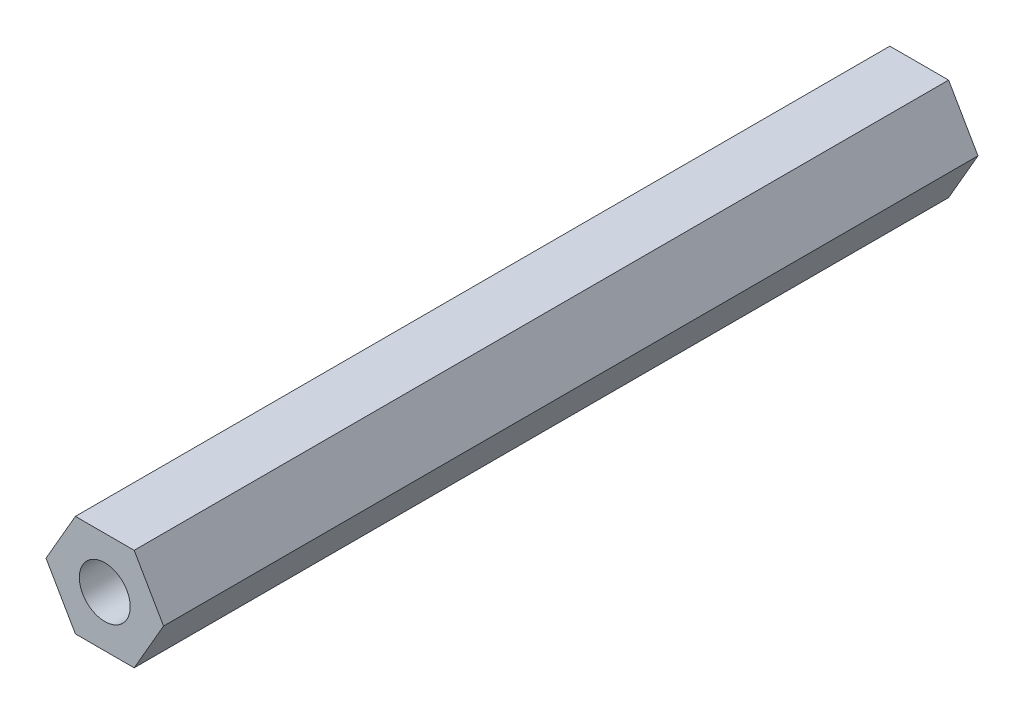
ISO-10303-21;
HEADER;
FILE_DESCRIPTION(('STEP AP214'),'2;1');
FILE_NAME('part.step','',(''),(''),'','','');
FILE_SCHEMA(('AUTOMOTIVE_DESIGN { 1 0 10303 214 1 1 1 1 }'));
ENDSEC;
DATA;
#1=APPLICATION_CONTEXT('core data for automotive mechanical design processes');
#2=APPLICATION_PROTOCOL_DEFINITION('international standard','automotive_design',2000,#1);
#3=PRODUCT_CONTEXT('',#1,'mechanical');
#4=PRODUCT('Part','Part','',(#3));
#5=PRODUCT_RELATED_PRODUCT_CATEGORY('part','',(#4));
#6=PRODUCT_DEFINITION_FORMATION('','',#4);
#7=PRODUCT_DEFINITION_CONTEXT('part definition',#1,'design');
#8=PRODUCT_DEFINITION('design','',#6,#7);
#9=PRODUCT_DEFINITION_SHAPE('','',#8);
#10=(LENGTH_UNIT() NAMED_UNIT(*) SI_UNIT(.MILLI.,.METRE.));
#11=(NAMED_UNIT(*) PLANE_ANGLE_UNIT() SI_UNIT($,.RADIAN.));
#12=(NAMED_UNIT(*) SI_UNIT($,.STERADIAN.) SOLID_ANGLE_UNIT());
#13=UNCERTAINTY_MEASURE_WITH_UNIT(LENGTH_MEASURE(1.E-05),#10,'distance_accuracy_value','');
#14=(GEOMETRIC_REPRESENTATION_CONTEXT(3) GLOBAL_UNCERTAINTY_ASSIGNED_CONTEXT((#13)) GLOBAL_UNIT_ASSIGNED_CONTEXT((#10,
#11,#12)) REPRESENTATION_CONTEXT('',''));
#15=CARTESIAN_POINT('',(0.,0.,0.));
#16=DIRECTION('',(0.,0.,1.));
#17=DIRECTION('',(1.,0.,0.));
#18=AXIS2_PLACEMENT_3D('',#15,#16,#17);
#19=CARTESIAN_POINT('',(0.,0.,101.6));
#20=DIRECTION('',(0.,0.,1.));
#21=DIRECTION('',(1.,0.,0.));
#22=AXIS2_PLACEMENT_3D('',#19,#20,#21);
#23=PLANE('',#22);
#24=DIRECTION('',(-0.5,0.866025403784439,0.));
#25=VECTOR('',#24,1.);
#26=CARTESIAN_POINT('',(7.33234841870825,0.,101.6));
#27=LINE('',#26,#25);
#28=CARTESIAN_POINT('',(7.33234841870825,0.,101.6));
#29=VERTEX_POINT('',#28);
#30=CARTESIAN_POINT('',(3.66617420935413,6.35,101.6));
#31=VERTEX_POINT('',#30);
#32=EDGE_CURVE('E146',#29,#31,#27,.T.);
#33=ORIENTED_EDGE('',*,*,#32,.T.);
#34=DIRECTION('',(-1.,0.,0.));
#35=VECTOR('',#34,1.);
#36=CARTESIAN_POINT('',(3.66617420935413,6.35,101.6));
#37=LINE('',#36,#35);
#38=CARTESIAN_POINT('',(-3.66617420935412,6.35,101.6));
#39=VERTEX_POINT('',#38);
#40=EDGE_CURVE('E94',#31,#39,#37,.T.);
#41=ORIENTED_EDGE('',*,*,#40,.T.);
#42=DIRECTION('',(-0.5,-0.866025403784438,0.));
#43=VECTOR('',#42,1.);
#44=CARTESIAN_POINT('',(-3.66617420935412,6.35,101.6));
#45=LINE('',#44,#43);
#46=CARTESIAN_POINT('',(-7.33234841870825,0.,101.6));
#47=VERTEX_POINT('',#46);
#48=EDGE_CURVE('E107',#39,#47,#45,.T.);
#49=ORIENTED_EDGE('',*,*,#48,.T.);
#50=DIRECTION('',(0.5,-0.866025403784439,0.));
#51=VECTOR('',#50,1.);
#52=CARTESIAN_POINT('',(-7.33234841870825,0.,101.6));
#53=LINE('',#52,#51);
#54=CARTESIAN_POINT('',(-3.66617420935413,-6.35,101.6));
#55=VERTEX_POINT('',#54);
#56=EDGE_CURVE('E101',#47,#55,#53,.T.);
#57=ORIENTED_EDGE('',*,*,#56,.T.);
#58=DIRECTION('',(1.,0.,0.));
#59=VECTOR('',#58,1.);
#60=CARTESIAN_POINT('',(-3.66617420935413,-6.35,101.6));
#61=LINE('',#60,#59);
#62=CARTESIAN_POINT('',(3.66617420935412,-6.35,101.6));
#63=VERTEX_POINT('',#62);
#64=EDGE_CURVE('E105',#55,#63,#61,.T.);
#65=ORIENTED_EDGE('',*,*,#64,.T.);
#66=DIRECTION('',(0.5,0.866025403784438,0.));
#67=VECTOR('',#66,1.);
#68=CARTESIAN_POINT('',(3.66617420935412,-6.35,101.6));
#69=LINE('',#68,#67);
#70=EDGE_CURVE('E57',#63,#29,#69,.T.);
#71=ORIENTED_EDGE('',*,*,#70,.T.);
#72=EDGE_LOOP('',(#33,#41,#49,#57,#65,#71));
#73=FACE_BOUND('',#72,.T.);
#74=CARTESIAN_POINT('',(0.,0.,101.6));
#75=DIRECTION('',(0.,0.,1.));
#76=DIRECTION('',(1.,0.,0.));
#77=AXIS2_PLACEMENT_3D('',#74,#75,#76);
#78=CIRCLE('',#77,3.175);
#79=CARTESIAN_POINT('',(3.175,0.,101.6));
#80=VERTEX_POINT('',#79);
#81=EDGE_CURVE('E134',#80,#80,#78,.T.);
#82=ORIENTED_EDGE('',*,*,#81,.F.);
#83=EDGE_LOOP('',(#82));
#84=FACE_BOUND('',#83,.T.);
#85=ADVANCED_FACE('F39',(#73,#84),#23,.T.);
#86=CARTESIAN_POINT('',(0.,0.,0.));
#87=DIRECTION('',(0.,0.,1.));
#88=DIRECTION('',(1.,0.,0.));
#89=AXIS2_PLACEMENT_3D('',#86,#87,#88);
#90=PLANE('',#89);
#91=DIRECTION('',(-0.5,0.866025403784439,0.));
#92=VECTOR('',#91,1.);
#93=CARTESIAN_POINT('',(7.33234841870825,0.,0.));
#94=LINE('',#93,#92);
#95=CARTESIAN_POINT('',(7.33234841870825,0.,0.));
#96=VERTEX_POINT('',#95);
#97=CARTESIAN_POINT('',(3.66617420935413,6.35,0.));
#98=VERTEX_POINT('',#97);
#99=EDGE_CURVE('E129',#96,#98,#94,.T.);
#100=ORIENTED_EDGE('',*,*,#99,.F.);
#101=DIRECTION('',(0.5,0.866025403784438,0.));
#102=VECTOR('',#101,1.);
#103=CARTESIAN_POINT('',(3.66617420935412,-6.35,0.));
#104=LINE('',#103,#102);
#105=CARTESIAN_POINT('',(3.66617420935412,-6.35,0.));
#106=VERTEX_POINT('',#105);
#107=EDGE_CURVE('E86',#106,#96,#104,.T.);
#108=ORIENTED_EDGE('',*,*,#107,.F.);
#109=DIRECTION('',(1.,0.,0.));
#110=VECTOR('',#109,1.);
#111=CARTESIAN_POINT('',(-3.66617420935413,-6.35,0.));
#112=LINE('',#111,#110);
#113=CARTESIAN_POINT('',(-3.66617420935413,-6.35,0.));
#114=VERTEX_POINT('',#113);
#115=EDGE_CURVE('E80',#114,#106,#112,.T.);
#116=ORIENTED_EDGE('',*,*,#115,.F.);
#117=DIRECTION('',(0.5,-0.866025403784439,0.));
#118=VECTOR('',#117,1.);
#119=CARTESIAN_POINT('',(-7.33234841870825,0.,0.));
#120=LINE('',#119,#118);
#121=CARTESIAN_POINT('',(-7.33234841870825,0.,0.));
#122=VERTEX_POINT('',#121);
#123=EDGE_CURVE('E116',#122,#114,#120,.T.);
#124=ORIENTED_EDGE('',*,*,#123,.F.);
#125=DIRECTION('',(-0.5,-0.866025403784438,0.));
#126=VECTOR('',#125,1.);
#127=CARTESIAN_POINT('',(-3.66617420935412,6.35,0.));
#128=LINE('',#127,#126);
#129=CARTESIAN_POINT('',(-3.66617420935412,6.35,0.));
#130=VERTEX_POINT('',#129);
#131=EDGE_CURVE('E137',#130,#122,#128,.T.);
#132=ORIENTED_EDGE('',*,*,#131,.F.);
#133=DIRECTION('',(-1.,0.,0.));
#134=VECTOR('',#133,1.);
#135=CARTESIAN_POINT('',(3.66617420935413,6.35,0.));
#136=LINE('',#135,#134);
#137=EDGE_CURVE('E133',#98,#130,#136,.T.);
#138=ORIENTED_EDGE('',*,*,#137,.F.);
#139=EDGE_LOOP('',(#100,#108,#116,#124,#132,#138));
#140=FACE_BOUND('',#139,.T.);
#141=CARTESIAN_POINT('',(0.,0.,0.));
#142=DIRECTION('',(0.,0.,1.));
#143=DIRECTION('',(1.,0.,0.));
#144=AXIS2_PLACEMENT_3D('',#141,#142,#143);
#145=CIRCLE('',#144,3.175);
#146=CARTESIAN_POINT('',(3.175,0.,0.));
#147=VERTEX_POINT('',#146);
#148=EDGE_CURVE('E243',#147,#147,#145,.T.);
#149=ORIENTED_EDGE('',*,*,#148,.T.);
#150=EDGE_LOOP('',(#149));
#151=FACE_BOUND('',#150,.T.);
#152=ADVANCED_FACE('F159',(#140,#151),#90,.F.);
#153=CARTESIAN_POINT('',(7.33234841870825,0.,101.6));
#154=DIRECTION('',(-0.866025403784439,-0.5,0.));
#155=DIRECTION('',(0.5,-0.866025403784439,0.));
#156=AXIS2_PLACEMENT_3D('',#153,#154,#155);
#157=PLANE('',#156);
#158=ORIENTED_EDGE('',*,*,#99,.T.);
#159=DIRECTION('',(0.,0.,-1.));
#160=VECTOR('',#159,1.);
#161=CARTESIAN_POINT('',(3.66617420935413,6.35,101.6));
#162=LINE('',#161,#160);
#163=EDGE_CURVE('E11',#31,#98,#162,.T.);
#164=ORIENTED_EDGE('',*,*,#163,.F.);
#165=ORIENTED_EDGE('',*,*,#32,.F.);
#166=DIRECTION('',(0.,0.,-1.));
#167=VECTOR('',#166,1.);
#168=CARTESIAN_POINT('',(7.33234841870825,0.,101.6));
#169=LINE('',#168,#167);
#170=EDGE_CURVE('E125',#29,#96,#169,.T.);
#171=ORIENTED_EDGE('',*,*,#170,.T.);
#172=EDGE_LOOP('',(#158,#164,#165,#171));
#173=FACE_BOUND('',#172,.T.);
#174=ADVANCED_FACE('F41',(#173),#157,.F.);
#175=CARTESIAN_POINT('',(3.66617420935413,6.35,101.6));
#176=DIRECTION('',(0.,-1.,0.));
#177=DIRECTION('',(1.,0.,0.));
#178=AXIS2_PLACEMENT_3D('',#175,#176,#177);
#179=PLANE('',#178);
#180=ORIENTED_EDGE('',*,*,#137,.T.);
#181=DIRECTION('',(0.,0.,-1.));
#182=VECTOR('',#181,1.);
#183=CARTESIAN_POINT('',(-3.66617420935412,6.35,101.6));
#184=LINE('',#183,#182);
#185=EDGE_CURVE('E49',#39,#130,#184,.T.);
#186=ORIENTED_EDGE('',*,*,#185,.F.);
#187=ORIENTED_EDGE('',*,*,#40,.F.);
#188=ORIENTED_EDGE('',*,*,#163,.T.);
#189=EDGE_LOOP('',(#180,#186,#187,#188));
#190=FACE_BOUND('',#189,.T.);
#191=ADVANCED_FACE('F184',(#190),#179,.F.);
#192=CARTESIAN_POINT('',(-3.66617420935412,6.35,101.6));
#193=DIRECTION('',(0.866025403784438,-0.5,0.));
#194=DIRECTION('',(0.5,0.866025403784439,0.));
#195=AXIS2_PLACEMENT_3D('',#192,#193,#194);
#196=PLANE('',#195);
#197=ORIENTED_EDGE('',*,*,#131,.T.);
#198=DIRECTION('',(0.,0.,-1.));
#199=VECTOR('',#198,1.);
#200=CARTESIAN_POINT('',(-7.33234841870825,0.,101.6));
#201=LINE('',#200,#199);
#202=EDGE_CURVE('E118',#47,#122,#201,.T.);
#203=ORIENTED_EDGE('',*,*,#202,.F.);
#204=ORIENTED_EDGE('',*,*,#48,.F.);
#205=ORIENTED_EDGE('',*,*,#185,.T.);
#206=EDGE_LOOP('',(#197,#203,#204,#205));
#207=FACE_BOUND('',#206,.T.);
#208=ADVANCED_FACE('F156',(#207),#196,.F.);
#209=CARTESIAN_POINT('',(-7.33234841870825,0.,101.6));
#210=DIRECTION('',(0.866025403784439,0.5,0.));
#211=DIRECTION('',(-0.5,0.866025403784439,0.));
#212=AXIS2_PLACEMENT_3D('',#209,#210,#211);
#213=PLANE('',#212);
#214=ORIENTED_EDGE('',*,*,#123,.T.);
#215=DIRECTION('',(0.,0.,-1.));
#216=VECTOR('',#215,1.);
#217=CARTESIAN_POINT('',(-3.66617420935413,-6.35,101.6));
#218=LINE('',#217,#216);
#219=EDGE_CURVE('E113',#55,#114,#218,.T.);
#220=ORIENTED_EDGE('',*,*,#219,.F.);
#221=ORIENTED_EDGE('',*,*,#56,.F.);
#222=ORIENTED_EDGE('',*,*,#202,.T.);
#223=EDGE_LOOP('',(#214,#220,#221,#222));
#224=FACE_BOUND('',#223,.T.);
#225=ADVANCED_FACE('F114',(#224),#213,.F.);
#226=CARTESIAN_POINT('',(-3.66617420935413,-6.35,101.6));
#227=DIRECTION('',(0.,1.,0.));
#228=DIRECTION('',(-1.,0.,0.));
#229=AXIS2_PLACEMENT_3D('',#226,#227,#228);
#230=PLANE('',#229);
#231=ORIENTED_EDGE('',*,*,#115,.T.);
#232=DIRECTION('',(0.,0.,-1.));
#233=VECTOR('',#232,1.);
#234=CARTESIAN_POINT('',(3.66617420935412,-6.35,101.6));
#235=LINE('',#234,#233);
#236=EDGE_CURVE('E119',#63,#106,#235,.T.);
#237=ORIENTED_EDGE('',*,*,#236,.F.);
#238=ORIENTED_EDGE('',*,*,#64,.F.);
#239=ORIENTED_EDGE('',*,*,#219,.T.);
#240=EDGE_LOOP('',(#231,#237,#238,#239));
#241=FACE_BOUND('',#240,.T.);
#242=ADVANCED_FACE('F121',(#241),#230,.F.);
#243=CARTESIAN_POINT('',(3.66617420935412,-6.35,101.6));
#244=DIRECTION('',(-0.866025403784438,0.5,0.));
#245=DIRECTION('',(-0.5,-0.866025403784438,0.));
#246=AXIS2_PLACEMENT_3D('',#243,#244,#245);
#247=PLANE('',#246);
#248=ORIENTED_EDGE('',*,*,#107,.T.);
#249=ORIENTED_EDGE('',*,*,#170,.F.);
#250=ORIENTED_EDGE('',*,*,#70,.F.);
#251=ORIENTED_EDGE('',*,*,#236,.T.);
#252=EDGE_LOOP('',(#248,#249,#250,#251));
#253=FACE_BOUND('',#252,.T.);
#254=ADVANCED_FACE('F164',(#253),#247,.F.);
#255=CARTESIAN_POINT('',(0.,0.,101.6));
#256=DIRECTION('',(0.,0.,-1.));
#257=DIRECTION('',(-1.,0.,0.));
#258=AXIS2_PLACEMENT_3D('',#255,#256,#257);
#259=CYLINDRICAL_SURFACE('',#258,3.175);
#260=ORIENTED_EDGE('',*,*,#81,.T.);
#261=EDGE_LOOP('',(#260));
#262=FACE_BOUND('',#261,.T.);
#263=ORIENTED_EDGE('',*,*,#148,.F.);
#264=EDGE_LOOP('',(#263));
#265=FACE_BOUND('',#264,.T.);
#266=ADVANCED_FACE('F166',(#262,#265),#259,.F.);
#267=CLOSED_SHELL('',(#85,#152,#174,#191,#208,#225,#242,#254,#266));
#268=MANIFOLD_SOLID_BREP('B2',#267);
#269=ADVANCED_BREP_SHAPE_REPRESENTATION('',(#18,#268),#14);
#270=SHAPE_DEFINITION_REPRESENTATION(#9,#269);
ENDSEC;
END-ISO-10303-21;
